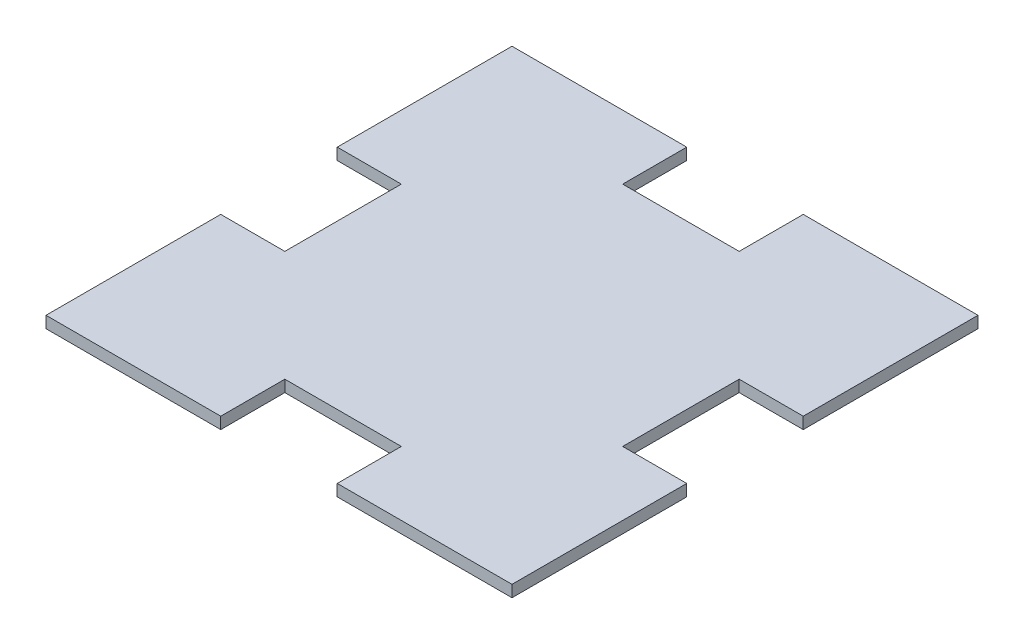
ISO-10303-21;
HEADER;
FILE_DESCRIPTION(('STEP AP214'),'2;1');
FILE_NAME('part.step','',(''),(''),'','','');
FILE_SCHEMA(('AUTOMOTIVE_DESIGN { 1 0 10303 214 1 1 1 1 }'));
ENDSEC;
DATA;
#1=APPLICATION_CONTEXT('core data for automotive mechanical design processes');
#2=APPLICATION_PROTOCOL_DEFINITION('international standard','automotive_design',2000,#1);
#3=PRODUCT_CONTEXT('',#1,'mechanical');
#4=PRODUCT('Part','Part','',(#3));
#5=PRODUCT_RELATED_PRODUCT_CATEGORY('part','',(#4));
#6=PRODUCT_DEFINITION_FORMATION('','',#4);
#7=PRODUCT_DEFINITION_CONTEXT('part definition',#1,'design');
#8=PRODUCT_DEFINITION('design','',#6,#7);
#9=PRODUCT_DEFINITION_SHAPE('','',#8);
#10=(LENGTH_UNIT() NAMED_UNIT(*) SI_UNIT(.MILLI.,.METRE.));
#11=(NAMED_UNIT(*) PLANE_ANGLE_UNIT() SI_UNIT($,.RADIAN.));
#12=(NAMED_UNIT(*) SI_UNIT($,.STERADIAN.) SOLID_ANGLE_UNIT());
#13=UNCERTAINTY_MEASURE_WITH_UNIT(LENGTH_MEASURE(1.E-05),#10,'distance_accuracy_value','');
#14=(GEOMETRIC_REPRESENTATION_CONTEXT(3) GLOBAL_UNCERTAINTY_ASSIGNED_CONTEXT((#13)) GLOBAL_UNIT_ASSIGNED_CONTEXT((#10,
#11,#12)) REPRESENTATION_CONTEXT('',''));
#15=CARTESIAN_POINT('',(0.,0.,0.));
#16=DIRECTION('',(0.,0.,1.));
#17=DIRECTION('',(1.,0.,0.));
#18=AXIS2_PLACEMENT_3D('',#15,#16,#17);
#19=CARTESIAN_POINT('',(127.,6.35,25.5118583856212));
#20=DIRECTION('',(-1.,0.,0.));
#21=DIRECTION('',(0.,0.,1.));
#22=AXIS2_PLACEMENT_3D('',#19,#20,#21);
#23=PLANE('',#22);
#24=DIRECTION('',(0.,0.,-1.));
#25=VECTOR('',#24,1.);
#26=CARTESIAN_POINT('',(127.,0.,25.5118583856212));
#27=LINE('',#26,#25);
#28=CARTESIAN_POINT('',(127.,0.,120.761858385621));
#29=VERTEX_POINT('',#28);
#30=CARTESIAN_POINT('',(127.,0.,25.5118583856212));
#31=VERTEX_POINT('',#30);
#32=EDGE_CURVE('E200',#29,#31,#27,.T.);
#33=ORIENTED_EDGE('',*,*,#32,.T.);
#34=DIRECTION('',(0.,-1.,0.));
#35=VECTOR('',#34,1.);
#36=CARTESIAN_POINT('',(127.,6.35,25.5118583856212));
#37=LINE('',#36,#35);
#38=CARTESIAN_POINT('',(127.,6.35,25.5118583856212));
#39=VERTEX_POINT('',#38);
#40=EDGE_CURVE('E11',#39,#31,#37,.T.);
#41=ORIENTED_EDGE('',*,*,#40,.F.);
#42=DIRECTION('',(0.,0.,-1.));
#43=VECTOR('',#42,1.);
#44=CARTESIAN_POINT('',(127.,6.35,25.5118583856212));
#45=LINE('',#44,#43);
#46=CARTESIAN_POINT('',(127.,6.35,120.761858385621));
#47=VERTEX_POINT('',#46);
#48=EDGE_CURVE('E238',#47,#39,#45,.T.);
#49=ORIENTED_EDGE('',*,*,#48,.F.);
#50=DIRECTION('',(0.,-1.,0.));
#51=VECTOR('',#50,1.);
#52=CARTESIAN_POINT('',(127.,6.35,120.761858385621));
#53=LINE('',#52,#51);
#54=EDGE_CURVE('E196',#47,#29,#53,.T.);
#55=ORIENTED_EDGE('',*,*,#54,.T.);
#56=EDGE_LOOP('',(#33,#41,#49,#55));
#57=FACE_BOUND('',#56,.T.);
#58=ADVANCED_FACE('F32',(#57),#23,.F.);
#59=CARTESIAN_POINT('',(92.0749999999999,6.35,25.5118583856212));
#60=DIRECTION('',(0.,0.,1.));
#61=DIRECTION('',(1.,0.,0.));
#62=AXIS2_PLACEMENT_3D('',#59,#60,#61);
#63=PLANE('',#62);
#64=DIRECTION('',(-1.,0.,0.));
#65=VECTOR('',#64,1.);
#66=CARTESIAN_POINT('',(92.0749999999999,0.,25.5118583856212));
#67=LINE('',#66,#65);
#68=CARTESIAN_POINT('',(92.0749999999999,0.,25.5118583856212));
#69=VERTEX_POINT('',#68);
#70=EDGE_CURVE('E203',#31,#69,#67,.T.);
#71=ORIENTED_EDGE('',*,*,#70,.T.);
#72=DIRECTION('',(0.,-1.,0.));
#73=VECTOR('',#72,1.);
#74=CARTESIAN_POINT('',(92.0749999999999,6.35,25.5118583856212));
#75=LINE('',#74,#73);
#76=CARTESIAN_POINT('',(92.0749999999999,6.35,25.5118583856212));
#77=VERTEX_POINT('',#76);
#78=EDGE_CURVE('E40',#77,#69,#75,.T.);
#79=ORIENTED_EDGE('',*,*,#78,.F.);
#80=DIRECTION('',(-1.,0.,0.));
#81=VECTOR('',#80,1.);
#82=CARTESIAN_POINT('',(92.0749999999999,6.35,25.5118583856212));
#83=LINE('',#82,#81);
#84=EDGE_CURVE('E127',#39,#77,#83,.T.);
#85=ORIENTED_EDGE('',*,*,#84,.F.);
#86=ORIENTED_EDGE('',*,*,#40,.T.);
#87=EDGE_LOOP('',(#71,#79,#85,#86));
#88=FACE_BOUND('',#87,.T.);
#89=ADVANCED_FACE('F356',(#88),#63,.F.);
#90=CARTESIAN_POINT('',(92.0749999999999,6.35,-37.9881416143788));
#91=DIRECTION('',(-1.,0.,0.));
#92=DIRECTION('',(0.,0.,1.));
#93=AXIS2_PLACEMENT_3D('',#90,#91,#92);
#94=PLANE('',#93);
#95=DIRECTION('',(0.,0.,-1.));
#96=VECTOR('',#95,1.);
#97=CARTESIAN_POINT('',(92.0749999999999,0.,-37.9881416143788));
#98=LINE('',#97,#96);
#99=CARTESIAN_POINT('',(92.0749999999999,0.,-37.9881416143788));
#100=VERTEX_POINT('',#99);
#101=EDGE_CURVE('E205',#69,#100,#98,.T.);
#102=ORIENTED_EDGE('',*,*,#101,.T.);
#103=DIRECTION('',(0.,-1.,0.));
#104=VECTOR('',#103,1.);
#105=CARTESIAN_POINT('',(92.0749999999999,6.35,-37.9881416143788));
#106=LINE('',#105,#104);
#107=CARTESIAN_POINT('',(92.0749999999999,6.35,-37.9881416143788));
#108=VERTEX_POINT('',#107);
#109=EDGE_CURVE('E281',#108,#100,#106,.T.);
#110=ORIENTED_EDGE('',*,*,#109,.F.);
#111=DIRECTION('',(0.,0.,-1.));
#112=VECTOR('',#111,1.);
#113=CARTESIAN_POINT('',(92.0749999999999,6.35,-37.9881416143788));
#114=LINE('',#113,#112);
#115=EDGE_CURVE('E289',#77,#108,#114,.T.);
#116=ORIENTED_EDGE('',*,*,#115,.F.);
#117=ORIENTED_EDGE('',*,*,#78,.T.);
#118=EDGE_LOOP('',(#102,#110,#116,#117));
#119=FACE_BOUND('',#118,.T.);
#120=ADVANCED_FACE('F287',(#119),#94,.F.);
#121=CARTESIAN_POINT('',(127.,6.35,-37.9881416143788));
#122=DIRECTION('',(0.,0.,-1.));
#123=DIRECTION('',(-1.,0.,0.));
#124=AXIS2_PLACEMENT_3D('',#121,#122,#123);
#125=PLANE('',#124);
#126=DIRECTION('',(1.,0.,0.));
#127=VECTOR('',#126,1.);
#128=CARTESIAN_POINT('',(127.,0.,-37.9881416143788));
#129=LINE('',#128,#127);
#130=CARTESIAN_POINT('',(127.,0.,-37.9881416143788));
#131=VERTEX_POINT('',#130);
#132=EDGE_CURVE('E207',#100,#131,#129,.T.);
#133=ORIENTED_EDGE('',*,*,#132,.T.);
#134=DIRECTION('',(0.,-1.,0.));
#135=VECTOR('',#134,1.);
#136=CARTESIAN_POINT('',(127.,6.35,-37.9881416143788));
#137=LINE('',#136,#135);
#138=CARTESIAN_POINT('',(127.,6.35,-37.9881416143788));
#139=VERTEX_POINT('',#138);
#140=EDGE_CURVE('E278',#139,#131,#137,.T.);
#141=ORIENTED_EDGE('',*,*,#140,.F.);
#142=DIRECTION('',(1.,0.,0.));
#143=VECTOR('',#142,1.);
#144=CARTESIAN_POINT('',(127.,6.35,-37.9881416143788));
#145=LINE('',#144,#143);
#146=EDGE_CURVE('E307',#108,#139,#145,.T.);
#147=ORIENTED_EDGE('',*,*,#146,.F.);
#148=ORIENTED_EDGE('',*,*,#109,.T.);
#149=EDGE_LOOP('',(#133,#141,#147,#148));
#150=FACE_BOUND('',#149,.T.);
#151=ADVANCED_FACE('F298',(#150),#125,.F.);
#152=CARTESIAN_POINT('',(127.,6.35,-133.238141614379));
#153=DIRECTION('',(-1.,0.,0.));
#154=DIRECTION('',(0.,0.,1.));
#155=AXIS2_PLACEMENT_3D('',#152,#153,#154);
#156=PLANE('',#155);
#157=DIRECTION('',(0.,0.,-1.));
#158=VECTOR('',#157,1.);
#159=CARTESIAN_POINT('',(127.,0.,-133.238141614379));
#160=LINE('',#159,#158);
#161=CARTESIAN_POINT('',(127.,0.,-133.238141614379));
#162=VERTEX_POINT('',#161);
#163=EDGE_CURVE('E209',#131,#162,#160,.T.);
#164=ORIENTED_EDGE('',*,*,#163,.T.);
#165=DIRECTION('',(0.,-1.,0.));
#166=VECTOR('',#165,1.);
#167=CARTESIAN_POINT('',(127.,6.35,-133.238141614379));
#168=LINE('',#167,#166);
#169=CARTESIAN_POINT('',(127.,6.35,-133.238141614379));
#170=VERTEX_POINT('',#169);
#171=EDGE_CURVE('E275',#170,#162,#168,.T.);
#172=ORIENTED_EDGE('',*,*,#171,.F.);
#173=DIRECTION('',(0.,0.,-1.));
#174=VECTOR('',#173,1.);
#175=CARTESIAN_POINT('',(127.,6.35,-133.238141614379));
#176=LINE('',#175,#174);
#177=EDGE_CURVE('E304',#139,#170,#176,.T.);
#178=ORIENTED_EDGE('',*,*,#177,.F.);
#179=ORIENTED_EDGE('',*,*,#140,.T.);
#180=EDGE_LOOP('',(#164,#172,#178,#179));
#181=FACE_BOUND('',#180,.T.);
#182=ADVANCED_FACE('F302',(#181),#156,.F.);
#183=CARTESIAN_POINT('',(31.7499999999999,6.35,-133.238141614379));
#184=DIRECTION('',(0.,0.,1.));
#185=DIRECTION('',(1.,0.,0.));
#186=AXIS2_PLACEMENT_3D('',#183,#184,#185);
#187=PLANE('',#186);
#188=DIRECTION('',(-1.,0.,0.));
#189=VECTOR('',#188,1.);
#190=CARTESIAN_POINT('',(31.7499999999999,0.,-133.238141614379));
#191=LINE('',#190,#189);
#192=CARTESIAN_POINT('',(31.7499999999999,0.,-133.238141614379));
#193=VERTEX_POINT('',#192);
#194=EDGE_CURVE('E211',#162,#193,#191,.T.);
#195=ORIENTED_EDGE('',*,*,#194,.T.);
#196=DIRECTION('',(0.,-1.,0.));
#197=VECTOR('',#196,1.);
#198=CARTESIAN_POINT('',(31.7499999999999,6.35,-133.238141614379));
#199=LINE('',#198,#197);
#200=CARTESIAN_POINT('',(31.7499999999999,6.35,-133.238141614379));
#201=VERTEX_POINT('',#200);
#202=EDGE_CURVE('E272',#201,#193,#199,.T.);
#203=ORIENTED_EDGE('',*,*,#202,.F.);
#204=DIRECTION('',(-1.,0.,0.));
#205=VECTOR('',#204,1.);
#206=CARTESIAN_POINT('',(31.7499999999999,6.35,-133.238141614379));
#207=LINE('',#206,#205);
#208=EDGE_CURVE('E306',#170,#201,#207,.T.);
#209=ORIENTED_EDGE('',*,*,#208,.F.);
#210=ORIENTED_EDGE('',*,*,#171,.T.);
#211=EDGE_LOOP('',(#195,#203,#209,#210));
#212=FACE_BOUND('',#211,.T.);
#213=ADVANCED_FACE('F369',(#212),#187,.F.);
#214=CARTESIAN_POINT('',(31.7499999999999,6.35,-98.3131416143788));
#215=DIRECTION('',(1.,0.,0.));
#216=DIRECTION('',(0.,0.,-1.));
#217=AXIS2_PLACEMENT_3D('',#214,#215,#216);
#218=PLANE('',#217);
#219=DIRECTION('',(0.,0.,1.));
#220=VECTOR('',#219,1.);
#221=CARTESIAN_POINT('',(31.7499999999999,0.,-98.3131416143788));
#222=LINE('',#221,#220);
#223=CARTESIAN_POINT('',(31.7499999999999,0.,-98.3131416143788));
#224=VERTEX_POINT('',#223);
#225=EDGE_CURVE('E213',#193,#224,#222,.T.);
#226=ORIENTED_EDGE('',*,*,#225,.T.);
#227=DIRECTION('',(0.,-1.,0.));
#228=VECTOR('',#227,1.);
#229=CARTESIAN_POINT('',(31.7499999999999,6.35,-98.3131416143788));
#230=LINE('',#229,#228);
#231=CARTESIAN_POINT('',(31.7499999999999,6.35,-98.3131416143788));
#232=VERTEX_POINT('',#231);
#233=EDGE_CURVE('E269',#232,#224,#230,.T.);
#234=ORIENTED_EDGE('',*,*,#233,.F.);
#235=DIRECTION('',(0.,0.,1.));
#236=VECTOR('',#235,1.);
#237=CARTESIAN_POINT('',(31.7499999999999,6.35,-98.3131416143788));
#238=LINE('',#237,#236);
#239=EDGE_CURVE('E309',#201,#232,#238,.T.);
#240=ORIENTED_EDGE('',*,*,#239,.F.);
#241=ORIENTED_EDGE('',*,*,#202,.T.);
#242=EDGE_LOOP('',(#226,#234,#240,#241));
#243=FACE_BOUND('',#242,.T.);
#244=ADVANCED_FACE('F372',(#243),#218,.F.);
#245=CARTESIAN_POINT('',(-31.7500000000001,6.35,-98.3131416143788));
#246=DIRECTION('',(0.,0.,1.));
#247=DIRECTION('',(1.,0.,0.));
#248=AXIS2_PLACEMENT_3D('',#245,#246,#247);
#249=PLANE('',#248);
#250=DIRECTION('',(-1.,0.,0.));
#251=VECTOR('',#250,1.);
#252=CARTESIAN_POINT('',(-31.7500000000001,0.,-98.3131416143788));
#253=LINE('',#252,#251);
#254=CARTESIAN_POINT('',(-31.7500000000001,0.,-98.3131416143788));
#255=VERTEX_POINT('',#254);
#256=EDGE_CURVE('E215',#224,#255,#253,.T.);
#257=ORIENTED_EDGE('',*,*,#256,.T.);
#258=DIRECTION('',(0.,-1.,0.));
#259=VECTOR('',#258,1.);
#260=CARTESIAN_POINT('',(-31.7500000000001,6.35,-98.3131416143788));
#261=LINE('',#260,#259);
#262=CARTESIAN_POINT('',(-31.7500000000001,6.35,-98.3131416143788));
#263=VERTEX_POINT('',#262);
#264=EDGE_CURVE('E266',#263,#255,#261,.T.);
#265=ORIENTED_EDGE('',*,*,#264,.F.);
#266=DIRECTION('',(-1.,0.,0.));
#267=VECTOR('',#266,1.);
#268=CARTESIAN_POINT('',(-31.7500000000001,6.35,-98.3131416143788));
#269=LINE('',#268,#267);
#270=EDGE_CURVE('E315',#232,#263,#269,.T.);
#271=ORIENTED_EDGE('',*,*,#270,.F.);
#272=ORIENTED_EDGE('',*,*,#233,.T.);
#273=EDGE_LOOP('',(#257,#265,#271,#272));
#274=FACE_BOUND('',#273,.T.);
#275=ADVANCED_FACE('F376',(#274),#249,.F.);
#276=CARTESIAN_POINT('',(-31.7500000000001,6.35,-133.238141614379));
#277=DIRECTION('',(-1.,0.,0.));
#278=DIRECTION('',(0.,0.,1.));
#279=AXIS2_PLACEMENT_3D('',#276,#277,#278);
#280=PLANE('',#279);
#281=DIRECTION('',(0.,0.,-1.));
#282=VECTOR('',#281,1.);
#283=CARTESIAN_POINT('',(-31.7500000000001,0.,-133.238141614379));
#284=LINE('',#283,#282);
#285=CARTESIAN_POINT('',(-31.7500000000001,0.,-133.238141614379));
#286=VERTEX_POINT('',#285);
#287=EDGE_CURVE('E217',#255,#286,#284,.T.);
#288=ORIENTED_EDGE('',*,*,#287,.T.);
#289=DIRECTION('',(0.,-1.,0.));
#290=VECTOR('',#289,1.);
#291=CARTESIAN_POINT('',(-31.7500000000001,6.35,-133.238141614379));
#292=LINE('',#291,#290);
#293=CARTESIAN_POINT('',(-31.7500000000001,6.35,-133.238141614379));
#294=VERTEX_POINT('',#293);
#295=EDGE_CURVE('E263',#294,#286,#292,.T.);
#296=ORIENTED_EDGE('',*,*,#295,.F.);
#297=DIRECTION('',(0.,0.,-1.));
#298=VECTOR('',#297,1.);
#299=CARTESIAN_POINT('',(-31.7500000000001,6.35,-133.238141614379));
#300=LINE('',#299,#298);
#301=EDGE_CURVE('E317',#263,#294,#300,.T.);
#302=ORIENTED_EDGE('',*,*,#301,.F.);
#303=ORIENTED_EDGE('',*,*,#264,.T.);
#304=EDGE_LOOP('',(#288,#296,#302,#303));
#305=FACE_BOUND('',#304,.T.);
#306=ADVANCED_FACE('F380',(#305),#280,.F.);
#307=CARTESIAN_POINT('',(-127.,6.35,-133.238141614379));
#308=DIRECTION('',(0.,0.,1.));
#309=DIRECTION('',(1.,0.,0.));
#310=AXIS2_PLACEMENT_3D('',#307,#308,#309);
#311=PLANE('',#310);
#312=DIRECTION('',(-1.,0.,0.));
#313=VECTOR('',#312,1.);
#314=CARTESIAN_POINT('',(-127.,0.,-133.238141614379));
#315=LINE('',#314,#313);
#316=CARTESIAN_POINT('',(-127.,0.,-133.238141614379));
#317=VERTEX_POINT('',#316);
#318=EDGE_CURVE('E219',#286,#317,#315,.T.);
#319=ORIENTED_EDGE('',*,*,#318,.T.);
#320=DIRECTION('',(0.,-1.,0.));
#321=VECTOR('',#320,1.);
#322=CARTESIAN_POINT('',(-127.,6.35,-133.238141614379));
#323=LINE('',#322,#321);
#324=CARTESIAN_POINT('',(-127.,6.35,-133.238141614379));
#325=VERTEX_POINT('',#324);
#326=EDGE_CURVE('E260',#325,#317,#323,.T.);
#327=ORIENTED_EDGE('',*,*,#326,.F.);
#328=DIRECTION('',(-1.,0.,0.));
#329=VECTOR('',#328,1.);
#330=CARTESIAN_POINT('',(-127.,6.35,-133.238141614379));
#331=LINE('',#330,#329);
#332=EDGE_CURVE('E319',#294,#325,#331,.T.);
#333=ORIENTED_EDGE('',*,*,#332,.F.);
#334=ORIENTED_EDGE('',*,*,#295,.T.);
#335=EDGE_LOOP('',(#319,#327,#333,#334));
#336=FACE_BOUND('',#335,.T.);
#337=ADVANCED_FACE('F384',(#336),#311,.F.);
#338=CARTESIAN_POINT('',(-127.,6.35,-133.238141614379));
#339=DIRECTION('',(1.,0.,0.));
#340=DIRECTION('',(0.,0.,-1.));
#341=AXIS2_PLACEMENT_3D('',#338,#339,#340);
#342=PLANE('',#341);
#343=DIRECTION('',(0.,0.,1.));
#344=VECTOR('',#343,1.);
#345=CARTESIAN_POINT('',(-127.,0.,-133.238141614379));
#346=LINE('',#345,#344);
#347=CARTESIAN_POINT('',(-127.,0.,-37.9881416143787));
#348=VERTEX_POINT('',#347);
#349=EDGE_CURVE('E221',#317,#348,#346,.T.);
#350=ORIENTED_EDGE('',*,*,#349,.T.);
#351=DIRECTION('',(0.,-1.,0.));
#352=VECTOR('',#351,1.);
#353=CARTESIAN_POINT('',(-127.,6.35,-37.9881416143787));
#354=LINE('',#353,#352);
#355=CARTESIAN_POINT('',(-127.,6.35,-37.9881416143787));
#356=VERTEX_POINT('',#355);
#357=EDGE_CURVE('E257',#356,#348,#354,.T.);
#358=ORIENTED_EDGE('',*,*,#357,.F.);
#359=DIRECTION('',(0.,0.,1.));
#360=VECTOR('',#359,1.);
#361=CARTESIAN_POINT('',(-127.,6.35,-133.238141614379));
#362=LINE('',#361,#360);
#363=EDGE_CURVE('E321',#325,#356,#362,.T.);
#364=ORIENTED_EDGE('',*,*,#363,.F.);
#365=ORIENTED_EDGE('',*,*,#326,.T.);
#366=EDGE_LOOP('',(#350,#358,#364,#365));
#367=FACE_BOUND('',#366,.T.);
#368=ADVANCED_FACE('F388',(#367),#342,.F.);
#369=CARTESIAN_POINT('',(-92.0750000000001,6.35,-37.9881416143787));
#370=DIRECTION('',(0.,0.,-1.));
#371=DIRECTION('',(-1.,0.,0.));
#372=AXIS2_PLACEMENT_3D('',#369,#370,#371);
#373=PLANE('',#372);
#374=DIRECTION('',(1.,0.,0.));
#375=VECTOR('',#374,1.);
#376=CARTESIAN_POINT('',(-92.0750000000001,0.,-37.9881416143787));
#377=LINE('',#376,#375);
#378=CARTESIAN_POINT('',(-92.0750000000001,0.,-37.9881416143787));
#379=VERTEX_POINT('',#378);
#380=EDGE_CURVE('E223',#348,#379,#377,.T.);
#381=ORIENTED_EDGE('',*,*,#380,.T.);
#382=DIRECTION('',(0.,-1.,0.));
#383=VECTOR('',#382,1.);
#384=CARTESIAN_POINT('',(-92.0750000000001,6.35,-37.9881416143787));
#385=LINE('',#384,#383);
#386=CARTESIAN_POINT('',(-92.0750000000001,6.35,-37.9881416143787));
#387=VERTEX_POINT('',#386);
#388=EDGE_CURVE('E254',#387,#379,#385,.T.);
#389=ORIENTED_EDGE('',*,*,#388,.F.);
#390=DIRECTION('',(1.,0.,0.));
#391=VECTOR('',#390,1.);
#392=CARTESIAN_POINT('',(-92.0750000000001,6.35,-37.9881416143787));
#393=LINE('',#392,#391);
#394=EDGE_CURVE('E323',#356,#387,#393,.T.);
#395=ORIENTED_EDGE('',*,*,#394,.F.);
#396=ORIENTED_EDGE('',*,*,#357,.T.);
#397=EDGE_LOOP('',(#381,#389,#395,#396));
#398=FACE_BOUND('',#397,.T.);
#399=ADVANCED_FACE('F392',(#398),#373,.F.);
#400=CARTESIAN_POINT('',(-92.0750000000001,6.35,-37.9881416143787));
#401=DIRECTION('',(1.,0.,0.));
#402=DIRECTION('',(0.,0.,-1.));
#403=AXIS2_PLACEMENT_3D('',#400,#401,#402);
#404=PLANE('',#403);
#405=DIRECTION('',(0.,0.,1.));
#406=VECTOR('',#405,1.);
#407=CARTESIAN_POINT('',(-92.0750000000001,0.,-37.9881416143787));
#408=LINE('',#407,#406);
#409=CARTESIAN_POINT('',(-92.0750000000001,0.,25.5118583856213));
#410=VERTEX_POINT('',#409);
#411=EDGE_CURVE('E225',#379,#410,#408,.T.);
#412=ORIENTED_EDGE('',*,*,#411,.T.);
#413=DIRECTION('',(0.,-1.,0.));
#414=VECTOR('',#413,1.);
#415=CARTESIAN_POINT('',(-92.0750000000001,6.35,25.5118583856213));
#416=LINE('',#415,#414);
#417=CARTESIAN_POINT('',(-92.0750000000001,6.35,25.5118583856213));
#418=VERTEX_POINT('',#417);
#419=EDGE_CURVE('E251',#418,#410,#416,.T.);
#420=ORIENTED_EDGE('',*,*,#419,.F.);
#421=DIRECTION('',(0.,0.,1.));
#422=VECTOR('',#421,1.);
#423=CARTESIAN_POINT('',(-92.0750000000001,6.35,-37.9881416143787));
#424=LINE('',#423,#422);
#425=EDGE_CURVE('E325',#387,#418,#424,.T.);
#426=ORIENTED_EDGE('',*,*,#425,.F.);
#427=ORIENTED_EDGE('',*,*,#388,.T.);
#428=EDGE_LOOP('',(#412,#420,#426,#427));
#429=FACE_BOUND('',#428,.T.);
#430=ADVANCED_FACE('F396',(#429),#404,.F.);
#431=CARTESIAN_POINT('',(-127.,6.35,25.5118583856213));
#432=DIRECTION('',(0.,0.,1.));
#433=DIRECTION('',(1.,0.,0.));
#434=AXIS2_PLACEMENT_3D('',#431,#432,#433);
#435=PLANE('',#434);
#436=DIRECTION('',(-1.,0.,0.));
#437=VECTOR('',#436,1.);
#438=CARTESIAN_POINT('',(-127.,0.,25.5118583856213));
#439=LINE('',#438,#437);
#440=CARTESIAN_POINT('',(-127.,0.,25.5118583856213));
#441=VERTEX_POINT('',#440);
#442=EDGE_CURVE('E227',#410,#441,#439,.T.);
#443=ORIENTED_EDGE('',*,*,#442,.T.);
#444=DIRECTION('',(0.,-1.,0.));
#445=VECTOR('',#444,1.);
#446=CARTESIAN_POINT('',(-127.,6.35,25.5118583856213));
#447=LINE('',#446,#445);
#448=CARTESIAN_POINT('',(-127.,6.35,25.5118583856213));
#449=VERTEX_POINT('',#448);
#450=EDGE_CURVE('E248',#449,#441,#447,.T.);
#451=ORIENTED_EDGE('',*,*,#450,.F.);
#452=DIRECTION('',(-1.,0.,0.));
#453=VECTOR('',#452,1.);
#454=CARTESIAN_POINT('',(-127.,6.35,25.5118583856213));
#455=LINE('',#454,#453);
#456=EDGE_CURVE('E327',#418,#449,#455,.T.);
#457=ORIENTED_EDGE('',*,*,#456,.F.);
#458=ORIENTED_EDGE('',*,*,#419,.T.);
#459=EDGE_LOOP('',(#443,#451,#457,#458));
#460=FACE_BOUND('',#459,.T.);
#461=ADVANCED_FACE('F400',(#460),#435,.F.);
#462=CARTESIAN_POINT('',(-127.,6.35,25.5118583856213));
#463=DIRECTION('',(1.,0.,0.));
#464=DIRECTION('',(0.,0.,-1.));
#465=AXIS2_PLACEMENT_3D('',#462,#463,#464);
#466=PLANE('',#465);
#467=DIRECTION('',(0.,0.,1.));
#468=VECTOR('',#467,1.);
#469=CARTESIAN_POINT('',(-127.,0.,25.5118583856213));
#470=LINE('',#469,#468);
#471=CARTESIAN_POINT('',(-127.,0.,120.761858385621));
#472=VERTEX_POINT('',#471);
#473=EDGE_CURVE('E229',#441,#472,#470,.T.);
#474=ORIENTED_EDGE('',*,*,#473,.T.);
#475=DIRECTION('',(0.,-1.,0.));
#476=VECTOR('',#475,1.);
#477=CARTESIAN_POINT('',(-127.,6.35,120.761858385621));
#478=LINE('',#477,#476);
#479=CARTESIAN_POINT('',(-127.,6.35,120.761858385621));
#480=VERTEX_POINT('',#479);
#481=EDGE_CURVE('E245',#480,#472,#478,.T.);
#482=ORIENTED_EDGE('',*,*,#481,.F.);
#483=DIRECTION('',(0.,0.,1.));
#484=VECTOR('',#483,1.);
#485=CARTESIAN_POINT('',(-127.,6.35,25.5118583856213));
#486=LINE('',#485,#484);
#487=EDGE_CURVE('E329',#449,#480,#486,.T.);
#488=ORIENTED_EDGE('',*,*,#487,.F.);
#489=ORIENTED_EDGE('',*,*,#450,.T.);
#490=EDGE_LOOP('',(#474,#482,#488,#489));
#491=FACE_BOUND('',#490,.T.);
#492=ADVANCED_FACE('F404',(#491),#466,.F.);
#493=CARTESIAN_POINT('',(-31.75,6.35,120.761858385621));
#494=DIRECTION('',(0.,0.,-1.));
#495=DIRECTION('',(-1.,0.,0.));
#496=AXIS2_PLACEMENT_3D('',#493,#494,#495);
#497=PLANE('',#496);
#498=DIRECTION('',(1.,0.,0.));
#499=VECTOR('',#498,1.);
#500=CARTESIAN_POINT('',(-31.75,0.,120.761858385621));
#501=LINE('',#500,#499);
#502=CARTESIAN_POINT('',(-31.75,0.,120.761858385621));
#503=VERTEX_POINT('',#502);
#504=EDGE_CURVE('E231',#472,#503,#501,.T.);
#505=ORIENTED_EDGE('',*,*,#504,.T.);
#506=DIRECTION('',(0.,-1.,0.));
#507=VECTOR('',#506,1.);
#508=CARTESIAN_POINT('',(-31.75,6.35,120.761858385621));
#509=LINE('',#508,#507);
#510=CARTESIAN_POINT('',(-31.75,6.35,120.761858385621));
#511=VERTEX_POINT('',#510);
#512=EDGE_CURVE('E242',#511,#503,#509,.T.);
#513=ORIENTED_EDGE('',*,*,#512,.F.);
#514=DIRECTION('',(1.,0.,0.));
#515=VECTOR('',#514,1.);
#516=CARTESIAN_POINT('',(-31.75,6.35,120.761858385621));
#517=LINE('',#516,#515);
#518=EDGE_CURVE('E331',#480,#511,#517,.T.);
#519=ORIENTED_EDGE('',*,*,#518,.F.);
#520=ORIENTED_EDGE('',*,*,#481,.T.);
#521=EDGE_LOOP('',(#505,#513,#519,#520));
#522=FACE_BOUND('',#521,.T.);
#523=ADVANCED_FACE('F337',(#522),#497,.F.);
#524=CARTESIAN_POINT('',(-31.75,6.35,85.8368583856212));
#525=DIRECTION('',(-1.,0.,0.));
#526=DIRECTION('',(0.,0.,1.));
#527=AXIS2_PLACEMENT_3D('',#524,#525,#526);
#528=PLANE('',#527);
#529=DIRECTION('',(0.,0.,-1.));
#530=VECTOR('',#529,1.);
#531=CARTESIAN_POINT('',(-31.75,0.,85.8368583856212));
#532=LINE('',#531,#530);
#533=CARTESIAN_POINT('',(-31.75,0.,85.8368583856212));
#534=VERTEX_POINT('',#533);
#535=EDGE_CURVE('E233',#503,#534,#532,.T.);
#536=ORIENTED_EDGE('',*,*,#535,.T.);
#537=DIRECTION('',(0.,-1.,0.));
#538=VECTOR('',#537,1.);
#539=CARTESIAN_POINT('',(-31.75,6.35,85.8368583856212));
#540=LINE('',#539,#538);
#541=CARTESIAN_POINT('',(-31.75,6.35,85.8368583856212));
#542=VERTEX_POINT('',#541);
#543=EDGE_CURVE('E191',#542,#534,#540,.T.);
#544=ORIENTED_EDGE('',*,*,#543,.F.);
#545=DIRECTION('',(0.,0.,-1.));
#546=VECTOR('',#545,1.);
#547=CARTESIAN_POINT('',(-31.75,6.35,85.8368583856212));
#548=LINE('',#547,#546);
#549=EDGE_CURVE('E182',#511,#542,#548,.T.);
#550=ORIENTED_EDGE('',*,*,#549,.F.);
#551=ORIENTED_EDGE('',*,*,#512,.T.);
#552=EDGE_LOOP('',(#536,#544,#550,#551));
#553=FACE_BOUND('',#552,.T.);
#554=ADVANCED_FACE('F341',(#553),#528,.F.);
#555=CARTESIAN_POINT('',(31.75,6.35,85.8368583856212));
#556=DIRECTION('',(0.,0.,-1.));
#557=DIRECTION('',(-1.,0.,0.));
#558=AXIS2_PLACEMENT_3D('',#555,#556,#557);
#559=PLANE('',#558);
#560=DIRECTION('',(1.,0.,0.));
#561=VECTOR('',#560,1.);
#562=CARTESIAN_POINT('',(31.75,0.,85.8368583856212));
#563=LINE('',#562,#561);
#564=CARTESIAN_POINT('',(31.75,0.,85.8368583856212));
#565=VERTEX_POINT('',#564);
#566=EDGE_CURVE('E190',#534,#565,#563,.T.);
#567=ORIENTED_EDGE('',*,*,#566,.T.);
#568=DIRECTION('',(0.,-1.,0.));
#569=VECTOR('',#568,1.);
#570=CARTESIAN_POINT('',(31.75,6.35,85.8368583856212));
#571=LINE('',#570,#569);
#572=CARTESIAN_POINT('',(31.75,6.35,85.8368583856212));
#573=VERTEX_POINT('',#572);
#574=EDGE_CURVE('E187',#573,#565,#571,.T.);
#575=ORIENTED_EDGE('',*,*,#574,.F.);
#576=DIRECTION('',(1.,0.,0.));
#577=VECTOR('',#576,1.);
#578=CARTESIAN_POINT('',(31.75,6.35,85.8368583856212));
#579=LINE('',#578,#577);
#580=EDGE_CURVE('E176',#542,#573,#579,.T.);
#581=ORIENTED_EDGE('',*,*,#580,.F.);
#582=ORIENTED_EDGE('',*,*,#543,.T.);
#583=EDGE_LOOP('',(#567,#575,#581,#582));
#584=FACE_BOUND('',#583,.T.);
#585=ADVANCED_FACE('F188',(#584),#559,.F.);
#586=CARTESIAN_POINT('',(31.75,6.35,120.761858385621));
#587=DIRECTION('',(1.,0.,0.));
#588=DIRECTION('',(0.,0.,-1.));
#589=AXIS2_PLACEMENT_3D('',#586,#587,#588);
#590=PLANE('',#589);
#591=DIRECTION('',(0.,0.,1.));
#592=VECTOR('',#591,1.);
#593=CARTESIAN_POINT('',(31.75,0.,120.761858385621));
#594=LINE('',#593,#592);
#595=CARTESIAN_POINT('',(31.75,0.,120.761858385621));
#596=VERTEX_POINT('',#595);
#597=EDGE_CURVE('E113',#565,#596,#594,.T.);
#598=ORIENTED_EDGE('',*,*,#597,.T.);
#599=DIRECTION('',(0.,-1.,0.));
#600=VECTOR('',#599,1.);
#601=CARTESIAN_POINT('',(31.75,6.35,120.761858385621));
#602=LINE('',#601,#600);
#603=CARTESIAN_POINT('',(31.75,6.35,120.761858385621));
#604=VERTEX_POINT('',#603);
#605=EDGE_CURVE('E192',#604,#596,#602,.T.);
#606=ORIENTED_EDGE('',*,*,#605,.F.);
#607=DIRECTION('',(0.,0.,1.));
#608=VECTOR('',#607,1.);
#609=CARTESIAN_POINT('',(31.75,6.35,120.761858385621));
#610=LINE('',#609,#608);
#611=EDGE_CURVE('E180',#573,#604,#610,.T.);
#612=ORIENTED_EDGE('',*,*,#611,.F.);
#613=ORIENTED_EDGE('',*,*,#574,.T.);
#614=EDGE_LOOP('',(#598,#606,#612,#613));
#615=FACE_BOUND('',#614,.T.);
#616=ADVANCED_FACE('F194',(#615),#590,.F.);
#617=CARTESIAN_POINT('',(127.,6.35,120.761858385621));
#618=DIRECTION('',(0.,0.,-1.));
#619=DIRECTION('',(-1.,0.,0.));
#620=AXIS2_PLACEMENT_3D('',#617,#618,#619);
#621=PLANE('',#620);
#622=DIRECTION('',(1.,0.,0.));
#623=VECTOR('',#622,1.);
#624=CARTESIAN_POINT('',(127.,0.,120.761858385621));
#625=LINE('',#624,#623);
#626=EDGE_CURVE('E119',#596,#29,#625,.T.);
#627=ORIENTED_EDGE('',*,*,#626,.T.);
#628=ORIENTED_EDGE('',*,*,#54,.F.);
#629=DIRECTION('',(1.,0.,0.));
#630=VECTOR('',#629,1.);
#631=CARTESIAN_POINT('',(127.,6.35,120.761858385621));
#632=LINE('',#631,#630);
#633=EDGE_CURVE('E48',#604,#47,#632,.T.);
#634=ORIENTED_EDGE('',*,*,#633,.F.);
#635=ORIENTED_EDGE('',*,*,#605,.T.);
#636=EDGE_LOOP('',(#627,#628,#634,#635));
#637=FACE_BOUND('',#636,.T.);
#638=ADVANCED_FACE('F345',(#637),#621,.F.);
#639=CARTESIAN_POINT('',(0.,6.35,0.));
#640=DIRECTION('',(0.,-1.,0.));
#641=DIRECTION('',(0.,0.,-1.));
#642=AXIS2_PLACEMENT_3D('',#639,#640,#641);
#643=PLANE('',#642);
#644=ORIENTED_EDGE('',*,*,#48,.T.);
#645=ORIENTED_EDGE('',*,*,#84,.T.);
#646=ORIENTED_EDGE('',*,*,#115,.T.);
#647=ORIENTED_EDGE('',*,*,#146,.T.);
#648=ORIENTED_EDGE('',*,*,#177,.T.);
#649=ORIENTED_EDGE('',*,*,#208,.T.);
#650=ORIENTED_EDGE('',*,*,#239,.T.);
#651=ORIENTED_EDGE('',*,*,#270,.T.);
#652=ORIENTED_EDGE('',*,*,#301,.T.);
#653=ORIENTED_EDGE('',*,*,#332,.T.);
#654=ORIENTED_EDGE('',*,*,#363,.T.);
#655=ORIENTED_EDGE('',*,*,#394,.T.);
#656=ORIENTED_EDGE('',*,*,#425,.T.);
#657=ORIENTED_EDGE('',*,*,#456,.T.);
#658=ORIENTED_EDGE('',*,*,#487,.T.);
#659=ORIENTED_EDGE('',*,*,#518,.T.);
#660=ORIENTED_EDGE('',*,*,#549,.T.);
#661=ORIENTED_EDGE('',*,*,#580,.T.);
#662=ORIENTED_EDGE('',*,*,#611,.T.);
#663=ORIENTED_EDGE('',*,*,#633,.T.);
#664=EDGE_LOOP('',(#644,#645,#646,#647,#648,#649,#650,#651,#652,#653,#654,#655,#656,#657,#658,
#659,#660,#661,#662,#663));
#665=FACE_BOUND('',#664,.T.);
#666=ADVANCED_FACE('F178',(#665),#643,.F.);
#667=CARTESIAN_POINT('',(0.,0.,0.));
#668=DIRECTION('',(0.,-1.,0.));
#669=DIRECTION('',(0.,0.,-1.));
#670=AXIS2_PLACEMENT_3D('',#667,#668,#669);
#671=PLANE('',#670);
#672=ORIENTED_EDGE('',*,*,#32,.F.);
#673=ORIENTED_EDGE('',*,*,#626,.F.);
#674=ORIENTED_EDGE('',*,*,#597,.F.);
#675=ORIENTED_EDGE('',*,*,#566,.F.);
#676=ORIENTED_EDGE('',*,*,#535,.F.);
#677=ORIENTED_EDGE('',*,*,#504,.F.);
#678=ORIENTED_EDGE('',*,*,#473,.F.);
#679=ORIENTED_EDGE('',*,*,#442,.F.);
#680=ORIENTED_EDGE('',*,*,#411,.F.);
#681=ORIENTED_EDGE('',*,*,#380,.F.);
#682=ORIENTED_EDGE('',*,*,#349,.F.);
#683=ORIENTED_EDGE('',*,*,#318,.F.);
#684=ORIENTED_EDGE('',*,*,#287,.F.);
#685=ORIENTED_EDGE('',*,*,#256,.F.);
#686=ORIENTED_EDGE('',*,*,#225,.F.);
#687=ORIENTED_EDGE('',*,*,#194,.F.);
#688=ORIENTED_EDGE('',*,*,#163,.F.);
#689=ORIENTED_EDGE('',*,*,#132,.F.);
#690=ORIENTED_EDGE('',*,*,#101,.F.);
#691=ORIENTED_EDGE('',*,*,#70,.F.);
#692=EDGE_LOOP('',(#672,#673,#674,#675,#676,#677,#678,#679,#680,#681,#682,#683,#684,#685,#686,
#687,#688,#689,#690,#691));
#693=FACE_BOUND('',#692,.T.);
#694=ADVANCED_FACE('F293',(#693),#671,.T.);
#695=CLOSED_SHELL('',(#58,#89,#120,#151,#182,#213,#244,#275,#306,#337,#368,#399,#430,#461,#492,
#523,#554,#585,#616,#638,#666,#694));
#696=MANIFOLD_SOLID_BREP('B2',#695);
#697=ADVANCED_BREP_SHAPE_REPRESENTATION('',(#18,#696),#14);
#698=SHAPE_DEFINITION_REPRESENTATION(#9,#697);
ENDSEC;
END-ISO-10303-21;
